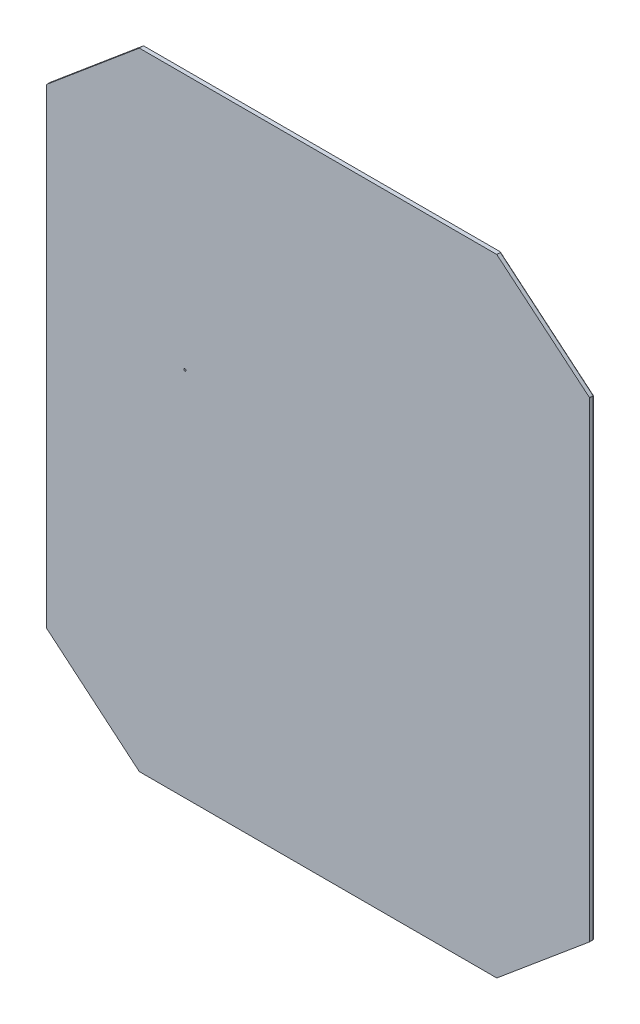
ISO-10303-21;
HEADER;
FILE_DESCRIPTION(('STEP AP214'),'2;1');
FILE_NAME('part.step','',(''),(''),'','','');
FILE_SCHEMA(('AUTOMOTIVE_DESIGN { 1 0 10303 214 1 1 1 1 }'));
ENDSEC;
DATA;
#1=APPLICATION_CONTEXT('core data for automotive mechanical design processes');
#2=APPLICATION_PROTOCOL_DEFINITION('international standard','automotive_design',2000,#1);
#3=PRODUCT_CONTEXT('',#1,'mechanical');
#4=PRODUCT('Part','Part','',(#3));
#5=PRODUCT_RELATED_PRODUCT_CATEGORY('part','',(#4));
#6=PRODUCT_DEFINITION_FORMATION('','',#4);
#7=PRODUCT_DEFINITION_CONTEXT('part definition',#1,'design');
#8=PRODUCT_DEFINITION('design','',#6,#7);
#9=PRODUCT_DEFINITION_SHAPE('','',#8);
#10=(LENGTH_UNIT() NAMED_UNIT(*) SI_UNIT(.MILLI.,.METRE.));
#11=(NAMED_UNIT(*) PLANE_ANGLE_UNIT() SI_UNIT($,.RADIAN.));
#12=(NAMED_UNIT(*) SI_UNIT($,.STERADIAN.) SOLID_ANGLE_UNIT());
#13=UNCERTAINTY_MEASURE_WITH_UNIT(LENGTH_MEASURE(1.E-05),#10,'distance_accuracy_value','');
#14=(GEOMETRIC_REPRESENTATION_CONTEXT(3) GLOBAL_UNCERTAINTY_ASSIGNED_CONTEXT((#13)) GLOBAL_UNIT_ASSIGNED_CONTEXT((#10,
#11,#12)) REPRESENTATION_CONTEXT('',''));
#15=CARTESIAN_POINT('',(0.,0.,0.));
#16=DIRECTION('',(0.,0.,1.));
#17=DIRECTION('',(1.,0.,0.));
#18=AXIS2_PLACEMENT_3D('',#15,#16,#17);
#19=CARTESIAN_POINT('',(-54.129658785069,2448.47514998125,2.));
#20=DIRECTION('',(0.,-1.,0.));
#21=DIRECTION('',(1.,0.,0.));
#22=AXIS2_PLACEMENT_3D('',#19,#20,#21);
#23=CYLINDRICAL_SURFACE('',#22,2.);
#24=DIRECTION('',(0.,-1.,0.));
#25=VECTOR('',#24,1.);
#26=CARTESIAN_POINT('',(-54.1296587850687,0.,0.));
#27=LINE('',#26,#25);
#28=CARTESIAN_POINT('',(-54.1296587850688,1069.56539523212,0.));
#29=VERTEX_POINT('',#28);
#30=CARTESIAN_POINT('',(-54.129658785069,2447.54258559121,0.));
#31=VERTEX_POINT('',#30);
#32=EDGE_CURVE('E237',#29,#31,#27,.F.);
#33=ORIENTED_EDGE('',*,*,#32,.F.);
#34=CARTESIAN_POINT('',(-54.1296587850688,1069.56539523212,2.));
#35=DIRECTION('',(0.,-1.,0.));
#36=DIRECTION('',(1.,0.,0.));
#37=AXIS2_PLACEMENT_3D('',#34,#35,#36);
#38=CIRCLE('',#37,2.);
#39=CARTESIAN_POINT('',(-56.1296587850688,1069.56539523212,2.));
#40=VERTEX_POINT('',#39);
#41=EDGE_CURVE('E253',#29,#40,#38,.F.);
#42=ORIENTED_EDGE('',*,*,#41,.T.);
#43=DIRECTION('',(0.,-1.,0.));
#44=VECTOR('',#43,1.);
#45=CARTESIAN_POINT('',(-56.129658785069,2448.47514998125,2.));
#46=LINE('',#45,#44);
#47=CARTESIAN_POINT('',(-56.129658785069,2447.54258559121,2.));
#48=VERTEX_POINT('',#47);
#49=EDGE_CURVE('E225',#48,#40,#46,.T.);
#50=ORIENTED_EDGE('',*,*,#49,.F.);
#51=CARTESIAN_POINT('',(-54.129658785069,2447.54258559121,2.));
#52=DIRECTION('',(0.,1.,0.));
#53=DIRECTION('',(0.,0.,1.));
#54=AXIS2_PLACEMENT_3D('',#51,#52,#53);
#55=CIRCLE('',#54,2.);
#56=EDGE_CURVE('E216',#31,#48,#55,.T.);
#57=ORIENTED_EDGE('',*,*,#56,.F.);
#58=EDGE_LOOP('',(#33,#42,#50,#57));
#59=FACE_BOUND('',#58,.T.);
#60=ADVANCED_FACE('F38',(#59),#23,.T.);
#61=CARTESIAN_POINT('',(1531.8095894244,1068.53127208685,2.));
#62=DIRECTION('',(0.,1.,0.));
#63=DIRECTION('',(0.,0.,1.));
#64=AXIS2_PLACEMENT_3D('',#61,#62,#63);
#65=CYLINDRICAL_SURFACE('',#64,2.);
#66=DIRECTION('',(0.,1.,0.));
#67=VECTOR('',#66,1.);
#68=CARTESIAN_POINT('',(1533.8095894244,1068.53127208685,2.));
#69=LINE('',#68,#67);
#70=CARTESIAN_POINT('',(1533.8095894244,1069.46560103322,2.));
#71=VERTEX_POINT('',#70);
#72=CARTESIAN_POINT('',(1533.8095894244,2447.61970402475,2.));
#73=VERTEX_POINT('',#72);
#74=EDGE_CURVE('E202',#71,#73,#69,.T.);
#75=ORIENTED_EDGE('',*,*,#74,.F.);
#76=CARTESIAN_POINT('',(1531.8095894244,1069.46560103322,2.));
#77=DIRECTION('',(0.,1.,0.));
#78=DIRECTION('',(0.,0.,1.));
#79=AXIS2_PLACEMENT_3D('',#76,#77,#78);
#80=CIRCLE('',#79,2.);
#81=CARTESIAN_POINT('',(1531.8095894244,1069.46560103322,0.));
#82=VERTEX_POINT('',#81);
#83=EDGE_CURVE('E62',#71,#82,#80,.T.);
#84=ORIENTED_EDGE('',*,*,#83,.T.);
#85=DIRECTION('',(0.,1.,0.));
#86=VECTOR('',#85,1.);
#87=CARTESIAN_POINT('',(1531.8095894244,0.,0.));
#88=LINE('',#87,#86);
#89=CARTESIAN_POINT('',(1531.8095894244,2447.61970402475,0.));
#90=VERTEX_POINT('',#89);
#91=EDGE_CURVE('E211',#90,#82,#88,.F.);
#92=ORIENTED_EDGE('',*,*,#91,.F.);
#93=CARTESIAN_POINT('',(1531.8095894244,2447.61970402475,2.));
#94=DIRECTION('',(0.,1.,2.22044604925031E-13));
#95=DIRECTION('',(0.,-2.22044604925031E-13,1.));
#96=AXIS2_PLACEMENT_3D('',#93,#94,#95);
#97=CIRCLE('',#96,2.);
#98=EDGE_CURVE('E165',#73,#90,#97,.T.);
#99=ORIENTED_EDGE('',*,*,#98,.F.);
#100=EDGE_LOOP('',(#75,#84,#92,#99));
#101=FACE_BOUND('',#100,.T.);
#102=ADVANCED_FACE('F370',(#101),#65,.T.);
#103=CARTESIAN_POINT('',(348.809589424397,1926.61056543439,11.9999999999964));
#104=DIRECTION('',(0.,0.,1.));
#105=DIRECTION('',(1.,0.,0.));
#106=AXIS2_PLACEMENT_3D('',#103,#104,#105);
#107=CYLINDRICAL_SURFACE('',#106,3.);
#108=CARTESIAN_POINT('',(348.809589424397,1926.61056543439,11.9749999999964));
#109=DIRECTION('',(0.,0.,1.));
#110=DIRECTION('',(1.,0.,0.));
#111=AXIS2_PLACEMENT_3D('',#108,#109,#110);
#112=CIRCLE('',#111,3.);
#113=CARTESIAN_POINT('',(351.809589424397,1926.61056543439,11.9749999999964));
#114=VERTEX_POINT('',#113);
#115=EDGE_CURVE('E437',#114,#114,#112,.T.);
#116=ORIENTED_EDGE('',*,*,#115,.T.);
#117=EDGE_LOOP('',(#116));
#118=FACE_BOUND('',#117,.T.);
#119=CARTESIAN_POINT('',(348.809589424397,1926.61056543439,0.));
#120=DIRECTION('',(0.,0.,1.));
#121=DIRECTION('',(1.,0.,0.));
#122=AXIS2_PLACEMENT_3D('',#119,#120,#121);
#123=CIRCLE('',#122,3.);
#124=CARTESIAN_POINT('',(351.809589424397,1926.61056543439,0.));
#125=VERTEX_POINT('',#124);
#126=EDGE_CURVE('E42',#125,#125,#123,.T.);
#127=ORIENTED_EDGE('',*,*,#126,.F.);
#128=EDGE_LOOP('',(#127));
#129=FACE_BOUND('',#128,.T.);
#130=ADVANCED_FACE('F353',(#118,#129),#107,.F.);
#131=CARTESIAN_POINT('',(-54.1296587850689,1069.56539523212,12.));
#132=DIRECTION('',(0.,0.,-1.));
#133=DIRECTION('',(-1.,0.,0.));
#134=AXIS2_PLACEMENT_3D('',#131,#132,#133);
#135=CYLINDRICAL_SURFACE('',#134,2.);
#136=CARTESIAN_POINT('',(-54.1296587850689,1069.56539523212,12.));
#137=DIRECTION('',(0.,0.,1.));
#138=DIRECTION('',(1.,0.,0.));
#139=AXIS2_PLACEMENT_3D('',#136,#137,#138);
#140=CIRCLE('',#139,2.);
#141=CARTESIAN_POINT('',(-56.1296587850688,1069.56539523212,12.));
#142=VERTEX_POINT('',#141);
#143=CARTESIAN_POINT('',(-55.4152980920153,1068.03336012403,12.));
#144=VERTEX_POINT('',#143);
#145=EDGE_CURVE('E251',#142,#144,#140,.T.);
#146=ORIENTED_EDGE('',*,*,#145,.F.);
#147=DIRECTION('',(0.,0.,-1.));
#148=VECTOR('',#147,1.);
#149=CARTESIAN_POINT('',(-56.1296587850688,1069.56539523212,12.));
#150=LINE('',#149,#148);
#151=EDGE_CURVE('E249',#40,#142,#150,.F.);
#152=ORIENTED_EDGE('',*,*,#151,.F.);
#153=CARTESIAN_POINT('',(-54.1296587850688,1069.56539523212,2.));
#154=DIRECTION('',(0.,0.,1.));
#155=DIRECTION('',(1.,0.,0.));
#156=AXIS2_PLACEMENT_3D('',#153,#154,#155);
#157=CIRCLE('',#156,2.);
#158=CARTESIAN_POINT('',(-55.4152980920152,1068.03336012403,2.));
#159=VERTEX_POINT('',#158);
#160=EDGE_CURVE('E260',#40,#159,#157,.T.);
#161=ORIENTED_EDGE('',*,*,#160,.T.);
#162=DIRECTION('',(0.,0.,-1.));
#163=VECTOR('',#162,1.);
#164=CARTESIAN_POINT('',(-55.4152980920153,1068.03336012403,12.));
#165=LINE('',#164,#163);
#166=EDGE_CURVE('E246',#144,#159,#165,.T.);
#167=ORIENTED_EDGE('',*,*,#166,.F.);
#168=EDGE_LOOP('',(#146,#152,#161,#167));
#169=FACE_BOUND('',#168,.T.);
#170=ADVANCED_FACE('F313',(#169),#135,.T.);
#171=CARTESIAN_POINT('',(-56.129658785069,2448.47514998125,12.));
#172=DIRECTION('',(1.,0.,0.));
#173=DIRECTION('',(0.,1.,0.));
#174=AXIS2_PLACEMENT_3D('',#171,#172,#173);
#175=PLANE('',#174);
#176=ORIENTED_EDGE('',*,*,#49,.T.);
#177=ORIENTED_EDGE('',*,*,#151,.T.);
#178=DIRECTION('',(0.,-1.,0.));
#179=VECTOR('',#178,1.);
#180=CARTESIAN_POINT('',(-56.129658785069,2448.47514998125,12.));
#181=LINE('',#180,#179);
#182=CARTESIAN_POINT('',(-56.129658785069,2447.54258559121,12.));
#183=VERTEX_POINT('',#182);
#184=EDGE_CURVE('E183',#183,#142,#181,.T.);
#185=ORIENTED_EDGE('',*,*,#184,.F.);
#186=DIRECTION('',(0.,0.,-1.));
#187=VECTOR('',#186,1.);
#188=CARTESIAN_POINT('',(-56.129658785069,2447.54258559121,12.));
#189=LINE('',#188,#187);
#190=EDGE_CURVE('E228',#183,#48,#189,.T.);
#191=ORIENTED_EDGE('',*,*,#190,.T.);
#192=EDGE_LOOP('',(#176,#177,#185,#191));
#193=FACE_BOUND('',#192,.T.);
#194=ADVANCED_FACE('F345',(#193),#175,.F.);
#195=CARTESIAN_POINT('',(1533.8095894244,1068.53127208685,12.));
#196=DIRECTION('',(-1.,0.,0.));
#197=DIRECTION('',(0.,0.,1.));
#198=AXIS2_PLACEMENT_3D('',#195,#196,#197);
#199=PLANE('',#198);
#200=DIRECTION('',(0.,1.,0.));
#201=VECTOR('',#200,1.);
#202=CARTESIAN_POINT('',(1533.8095894244,1068.53127208685,12.));
#203=LINE('',#202,#201);
#204=CARTESIAN_POINT('',(1533.8095894244,1069.46560103322,12.));
#205=VERTEX_POINT('',#204);
#206=CARTESIAN_POINT('',(1533.8095894244,2447.61970402475,12.));
#207=VERTEX_POINT('',#206);
#208=EDGE_CURVE('E174',#205,#207,#203,.T.);
#209=ORIENTED_EDGE('',*,*,#208,.F.);
#210=DIRECTION('',(0.,0.,-1.));
#211=VECTOR('',#210,1.);
#212=CARTESIAN_POINT('',(1533.8095894244,1069.46560103322,12.));
#213=LINE('',#212,#211);
#214=EDGE_CURVE('E259',#205,#71,#213,.T.);
#215=ORIENTED_EDGE('',*,*,#214,.T.);
#216=ORIENTED_EDGE('',*,*,#74,.T.);
#217=DIRECTION('',(0.,0.,-1.));
#218=VECTOR('',#217,1.);
#219=CARTESIAN_POINT('',(1533.8095894244,2447.61970402475,12.));
#220=LINE('',#219,#218);
#221=EDGE_CURVE('E204',#73,#207,#220,.F.);
#222=ORIENTED_EDGE('',*,*,#221,.T.);
#223=EDGE_LOOP('',(#209,#215,#216,#222));
#224=FACE_BOUND('',#223,.T.);
#225=ADVANCED_FACE('F286',(#224),#199,.F.);
#226=CARTESIAN_POINT('',(1531.8095894244,1069.46560103322,12.));
#227=DIRECTION('',(0.,0.,-1.));
#228=DIRECTION('',(-1.,0.,0.));
#229=AXIS2_PLACEMENT_3D('',#226,#227,#228);
#230=CYLINDRICAL_SURFACE('',#229,2.);
#231=CARTESIAN_POINT('',(1531.8095894244,1069.46560103322,12.));
#232=DIRECTION('',(0.,0.,1.));
#233=DIRECTION('',(1.,0.,0.));
#234=AXIS2_PLACEMENT_3D('',#231,#232,#233);
#235=CIRCLE('',#234,2.);
#236=CARTESIAN_POINT('',(1533.09300756478,1067.93170472743,12.));
#237=VERTEX_POINT('',#236);
#238=EDGE_CURVE('E270',#237,#205,#235,.T.);
#239=ORIENTED_EDGE('',*,*,#238,.F.);
#240=DIRECTION('',(0.,0.,-1.));
#241=VECTOR('',#240,1.);
#242=CARTESIAN_POINT('',(1533.09300756478,1067.93170472743,12.));
#243=LINE('',#242,#241);
#244=CARTESIAN_POINT('',(1533.09300756478,1067.93170472743,2.));
#245=VERTEX_POINT('',#244);
#246=EDGE_CURVE('E171',#245,#237,#243,.F.);
#247=ORIENTED_EDGE('',*,*,#246,.F.);
#248=CARTESIAN_POINT('',(1531.8095894244,1069.46560103322,2.));
#249=DIRECTION('',(0.,0.,1.));
#250=DIRECTION('',(1.,0.,0.));
#251=AXIS2_PLACEMENT_3D('',#248,#249,#250);
#252=CIRCLE('',#251,2.);
#253=EDGE_CURVE('E274',#245,#71,#252,.T.);
#254=ORIENTED_EDGE('',*,*,#253,.T.);
#255=ORIENTED_EDGE('',*,*,#214,.F.);
#256=EDGE_LOOP('',(#239,#247,#254,#255));
#257=FACE_BOUND('',#256,.T.);
#258=ADVANCED_FACE('F282',(#257),#230,.T.);
#259=CARTESIAN_POINT('',(348.809589424397,1926.61056543439,11.9999999999964));
#260=DIRECTION('',(0.,0.,1.));
#261=DIRECTION('',(1.,0.,0.));
#262=AXIS2_PLACEMENT_3D('',#259,#260,#261);
#263=CONICAL_SURFACE('',#262,3.025,0.785398163397344);
#264=ORIENTED_EDGE('',*,*,#115,.F.);
#265=EDGE_LOOP('',(#264));
#266=FACE_BOUND('',#265,.T.);
#267=CARTESIAN_POINT('',(348.809589424397,1926.61056543439,11.9999999999964));
#268=DIRECTION('',(0.,0.,1.));
#269=DIRECTION('',(1.,0.,0.));
#270=AXIS2_PLACEMENT_3D('',#267,#268,#269);
#271=CIRCLE('',#270,3.025);
#272=CARTESIAN_POINT('',(351.834589424397,1926.61056543439,11.9999999999964));
#273=VERTEX_POINT('',#272);
#274=EDGE_CURVE('E436',#273,#273,#271,.T.);
#275=ORIENTED_EDGE('',*,*,#274,.T.);
#276=EDGE_LOOP('',(#275));
#277=FACE_BOUND('',#276,.T.);
#278=ADVANCED_FACE('F386',(#266,#277),#263,.F.);
#279=CARTESIAN_POINT('',(-54.129658785069,2447.54258559121,12.));
#280=DIRECTION('',(0.,0.,-1.));
#281=DIRECTION('',(-1.,0.,0.));
#282=AXIS2_PLACEMENT_3D('',#279,#280,#281);
#283=CYLINDRICAL_SURFACE('',#282,2.);
#284=CARTESIAN_POINT('',(-54.129658785069,2447.54258559121,12.));
#285=DIRECTION('',(0.,0.,1.));
#286=DIRECTION('',(1.,0.,0.));
#287=AXIS2_PLACEMENT_3D('',#284,#285,#286);
#288=CIRCLE('',#287,2.);
#289=CARTESIAN_POINT('',(-55.4152980920152,2449.0746206993,12.));
#290=VERTEX_POINT('',#289);
#291=EDGE_CURVE('E233',#290,#183,#288,.T.);
#292=ORIENTED_EDGE('',*,*,#291,.F.);
#293=DIRECTION('',(0.,0.,-1.));
#294=VECTOR('',#293,1.);
#295=CARTESIAN_POINT('',(-55.4152980920153,2449.0746206993,12.));
#296=LINE('',#295,#294);
#297=CARTESIAN_POINT('',(-55.4152980920154,2449.0746206993,2.));
#298=VERTEX_POINT('',#297);
#299=EDGE_CURVE('E231',#298,#290,#296,.F.);
#300=ORIENTED_EDGE('',*,*,#299,.F.);
#301=CARTESIAN_POINT('',(-54.1296587850689,2447.54258559121,2.));
#302=DIRECTION('',(0.,0.,1.));
#303=DIRECTION('',(1.,0.,0.));
#304=AXIS2_PLACEMENT_3D('',#301,#302,#303);
#305=CIRCLE('',#304,2.);
#306=EDGE_CURVE('E240',#298,#48,#305,.T.);
#307=ORIENTED_EDGE('',*,*,#306,.T.);
#308=ORIENTED_EDGE('',*,*,#190,.F.);
#309=EDGE_LOOP('',(#292,#300,#307,#308));
#310=FACE_BOUND('',#309,.T.);
#311=ADVANCED_FACE('F344',(#310),#283,.T.);
#312=CARTESIAN_POINT('',(1531.8095894244,2447.61970402475,12.));
#313=DIRECTION('',(0.,0.,-1.));
#314=DIRECTION('',(-1.,0.,0.));
#315=AXIS2_PLACEMENT_3D('',#312,#313,#314);
#316=CYLINDRICAL_SURFACE('',#315,2.);
#317=CARTESIAN_POINT('',(1531.8095894244,2447.61970402475,12.));
#318=DIRECTION('',(0.,0.,1.));
#319=DIRECTION('',(1.,0.,0.));
#320=AXIS2_PLACEMENT_3D('',#317,#318,#319);
#321=CIRCLE('',#320,2.);
#322=CARTESIAN_POINT('',(1533.09306115109,2449.15355549304,12.));
#323=VERTEX_POINT('',#322);
#324=EDGE_CURVE('E207',#207,#323,#321,.T.);
#325=ORIENTED_EDGE('',*,*,#324,.F.);
#326=ORIENTED_EDGE('',*,*,#221,.F.);
#327=CARTESIAN_POINT('',(1531.8095894244,2447.61970402475,2.));
#328=DIRECTION('',(0.,0.,1.));
#329=DIRECTION('',(1.,0.,0.));
#330=AXIS2_PLACEMENT_3D('',#327,#328,#329);
#331=CIRCLE('',#330,2.);
#332=CARTESIAN_POINT('',(1533.09306115109,2449.15355549304,2.));
#333=VERTEX_POINT('',#332);
#334=EDGE_CURVE('E214',#73,#333,#331,.T.);
#335=ORIENTED_EDGE('',*,*,#334,.T.);
#336=DIRECTION('',(0.,0.,-1.));
#337=VECTOR('',#336,1.);
#338=CARTESIAN_POINT('',(1533.09306115109,2449.15355549304,12.));
#339=LINE('',#338,#337);
#340=EDGE_CURVE('E199',#323,#333,#339,.T.);
#341=ORIENTED_EDGE('',*,*,#340,.F.);
#342=EDGE_LOOP('',(#325,#326,#335,#341));
#343=FACE_BOUND('',#342,.T.);
#344=ADVANCED_FACE('F400',(#343),#316,.T.);
#345=CARTESIAN_POINT('',(0.,0.,12.));
#346=DIRECTION('',(0.,0.,1.));
#347=DIRECTION('',(1.,0.,0.));
#348=AXIS2_PLACEMENT_3D('',#345,#346,#347);
#349=PLANE('',#348);
#350=ORIENTED_EDGE('',*,*,#274,.F.);
#351=EDGE_LOOP('',(#350));
#352=FACE_BOUND('',#351,.T.);
#353=DIRECTION('',(0.766948152896775,0.641709070193203,0.));
#354=VECTOR('',#353,1.);
#355=CARTESIAN_POINT('',(1151.3095894244,748.491751264202,12.));
#356=LINE('',#355,#354);
#357=CARTESIAN_POINT('',(1261.9367281695,841.053990411817,12.));
#358=VERTEX_POINT('',#357);
#359=EDGE_CURVE('E168',#358,#237,#356,.T.);
#360=ORIENTED_EDGE('',*,*,#359,.T.);
#361=ORIENTED_EDGE('',*,*,#238,.T.);
#362=ORIENTED_EDGE('',*,*,#208,.T.);
#363=ORIENTED_EDGE('',*,*,#324,.T.);
#364=DIRECTION('',(-0.766925734145325,0.641735863346949,0.));
#365=VECTOR('',#364,1.);
#366=CARTESIAN_POINT('',(1151.3095894244,2768.61622955908,12.));
#367=LINE('',#366,#365);
#368=CARTESIAN_POINT('',(1261.92887574869,2676.05399041182,12.));
#369=VERTEX_POINT('',#368);
#370=EDGE_CURVE('E289',#323,#369,#367,.T.);
#371=ORIENTED_EDGE('',*,*,#370,.T.);
#372=DIRECTION('',(-1.,0.,0.));
#373=VECTOR('',#372,1.);
#374=CARTESIAN_POINT('',(1.93696365804209E-12,2676.05399041182,12.));
#375=LINE('',#374,#373);
#376=CARTESIAN_POINT('',(215.065202413765,2676.05399041182,12.));
#377=VERTEX_POINT('',#376);
#378=EDGE_CURVE('E290',#369,#377,#375,.T.);
#379=ORIENTED_EDGE('',*,*,#378,.T.);
#380=DIRECTION('',(-0.766017554047301,-0.642819653473188,0.));
#381=VECTOR('',#380,1.);
#382=CARTESIAN_POINT('',(-56.129658785069,2448.47514998125,12.));
#383=LINE('',#382,#381);
#384=EDGE_CURVE('E179',#377,#290,#383,.T.);
#385=ORIENTED_EDGE('',*,*,#384,.T.);
#386=ORIENTED_EDGE('',*,*,#291,.T.);
#387=ORIENTED_EDGE('',*,*,#184,.T.);
#388=ORIENTED_EDGE('',*,*,#145,.T.);
#389=DIRECTION('',(0.766017554047301,-0.642819653473189,0.));
#390=VECTOR('',#389,1.);
#391=CARTESIAN_POINT('',(326.309589424397,747.700936122895,12.));
#392=LINE('',#391,#390);
#393=CARTESIAN_POINT('',(215.065202413403,841.053990411817,12.));
#394=VERTEX_POINT('',#393);
#395=EDGE_CURVE('E175',#144,#394,#392,.T.);
#396=ORIENTED_EDGE('',*,*,#395,.T.);
#397=DIRECTION('',(1.,0.,0.));
#398=VECTOR('',#397,1.);
#399=CARTESIAN_POINT('',(-6.11684115650869E-13,841.053990411816,12.));
#400=LINE('',#399,#398);
#401=EDGE_CURVE('E159',#394,#358,#400,.T.);
#402=ORIENTED_EDGE('',*,*,#401,.T.);
#403=EDGE_LOOP('',(#360,#361,#362,#363,#371,#379,#385,#386,#387,#388,#396,#402));
#404=FACE_BOUND('',#403,.T.);
#405=ADVANCED_FACE('F177',(#352,#404),#349,.T.);
#406=CARTESIAN_POINT('',(-56.129658785069,2448.47514998125,12.));
#407=DIRECTION('',(0.642819653473189,-0.766017554047301,0.));
#408=DIRECTION('',(0.766017554047301,0.642819653473189,0.));
#409=AXIS2_PLACEMENT_3D('',#406,#407,#408);
#410=PLANE('',#409);
#411=DIRECTION('',(-0.766017554047301,-0.642819653473189,0.));
#412=VECTOR('',#411,1.);
#413=CARTESIAN_POINT('',(-56.129658785069,2448.47514998125,2.));
#414=LINE('',#413,#412);
#415=CARTESIAN_POINT('',(215.065202413765,2676.05399041182,2.));
#416=VERTEX_POINT('',#415);
#417=EDGE_CURVE('E213',#416,#298,#414,.T.);
#418=ORIENTED_EDGE('',*,*,#417,.T.);
#419=ORIENTED_EDGE('',*,*,#299,.T.);
#420=ORIENTED_EDGE('',*,*,#384,.F.);
#421=DIRECTION('',(0.,0.,1.));
#422=VECTOR('',#421,1.);
#423=CARTESIAN_POINT('',(215.065202413765,2676.05399041182,11.9999999999981));
#424=LINE('',#423,#422);
#425=EDGE_CURVE('E295',#416,#377,#424,.T.);
#426=ORIENTED_EDGE('',*,*,#425,.F.);
#427=EDGE_LOOP('',(#418,#419,#420,#426));
#428=FACE_BOUND('',#427,.T.);
#429=ADVANCED_FACE('F341',(#428),#410,.F.);
#430=CARTESIAN_POINT('',(-54.129658785069,2447.54258559121,2.));
#431=DIRECTION('',(1.,0.,0.));
#432=DIRECTION('',(0.,1.,0.));
#433=AXIS2_PLACEMENT_3D('',#430,#431,#432);
#434=SPHERICAL_SURFACE('',#433,2.);
#435=CARTESIAN_POINT('',(-54.1296587850689,2447.54258559121,2.));
#436=DIRECTION('',(-0.766017554047301,-0.642819653473189,0.));
#437=DIRECTION('',(0.642819653473189,-0.766017554047301,0.));
#438=AXIS2_PLACEMENT_3D('',#435,#436,#437);
#439=CIRCLE('',#438,2.);
#440=EDGE_CURVE('E235',#31,#298,#439,.F.);
#441=ORIENTED_EDGE('',*,*,#440,.F.);
#442=ORIENTED_EDGE('',*,*,#56,.T.);
#443=ORIENTED_EDGE('',*,*,#306,.F.);
#444=EDGE_LOOP('',(#441,#442,#443));
#445=FACE_BOUND('',#444,.T.);
#446=ADVANCED_FACE('F333',(#445),#434,.T.);
#447=CARTESIAN_POINT('',(326.309589424397,747.700936122895,12.));
#448=DIRECTION('',(0.642819653473188,0.766017554047301,0.));
#449=DIRECTION('',(-0.766017554047301,0.642819653473189,0.));
#450=AXIS2_PLACEMENT_3D('',#447,#448,#449);
#451=PLANE('',#450);
#452=ORIENTED_EDGE('',*,*,#395,.F.);
#453=ORIENTED_EDGE('',*,*,#166,.T.);
#454=DIRECTION('',(0.766017554047301,-0.642819653473189,0.));
#455=VECTOR('',#454,1.);
#456=CARTESIAN_POINT('',(326.309589424397,747.700936122895,2.));
#457=LINE('',#456,#455);
#458=CARTESIAN_POINT('',(215.065202413404,841.053990411817,2.));
#459=VERTEX_POINT('',#458);
#460=EDGE_CURVE('E239',#159,#459,#457,.T.);
#461=ORIENTED_EDGE('',*,*,#460,.T.);
#462=DIRECTION('',(0.,0.,-1.));
#463=VECTOR('',#462,1.);
#464=CARTESIAN_POINT('',(215.065202413403,841.053990411817,11.9999999999993));
#465=LINE('',#464,#463);
#466=EDGE_CURVE('E164',#394,#459,#465,.T.);
#467=ORIENTED_EDGE('',*,*,#466,.F.);
#468=EDGE_LOOP('',(#452,#453,#461,#467));
#469=FACE_BOUND('',#468,.T.);
#470=ADVANCED_FACE('F316',(#469),#451,.F.);
#471=CARTESIAN_POINT('',(1151.3095894244,748.491751264202,12.));
#472=DIRECTION('',(-0.641709070193203,0.766948152896774,0.));
#473=DIRECTION('',(-0.766948152896775,-0.641709070193203,0.));
#474=AXIS2_PLACEMENT_3D('',#471,#472,#473);
#475=PLANE('',#474);
#476=DIRECTION('',(0.766948152896775,0.641709070193203,0.));
#477=VECTOR('',#476,1.);
#478=CARTESIAN_POINT('',(1151.3095894244,748.491751264202,2.));
#479=LINE('',#478,#477);
#480=CARTESIAN_POINT('',(1261.9367281695,841.053990411817,2.));
#481=VERTEX_POINT('',#480);
#482=EDGE_CURVE('E267',#481,#245,#479,.T.);
#483=ORIENTED_EDGE('',*,*,#482,.T.);
#484=ORIENTED_EDGE('',*,*,#246,.T.);
#485=ORIENTED_EDGE('',*,*,#359,.F.);
#486=DIRECTION('',(0.,0.,1.));
#487=VECTOR('',#486,1.);
#488=CARTESIAN_POINT('',(1261.9367281695,841.053990411817,11.9999999999993));
#489=LINE('',#488,#487);
#490=EDGE_CURVE('E154',#481,#358,#489,.T.);
#491=ORIENTED_EDGE('',*,*,#490,.F.);
#492=EDGE_LOOP('',(#483,#484,#485,#491));
#493=FACE_BOUND('',#492,.T.);
#494=ADVANCED_FACE('F169',(#493),#475,.F.);
#495=CARTESIAN_POINT('',(1531.8095894244,1069.46560103322,2.));
#496=DIRECTION('',(-0.641709070193203,0.766948152896774,0.));
#497=DIRECTION('',(-0.766948152896775,-0.641709070193203,0.));
#498=AXIS2_PLACEMENT_3D('',#495,#496,#497);
#499=SPHERICAL_SURFACE('',#498,2.);
#500=CARTESIAN_POINT('',(1531.8095894244,1069.46560103322,2.));
#501=DIRECTION('',(0.76694815289677,0.641709070193209,0.));
#502=DIRECTION('',(-0.641709070193209,0.76694815289677,0.));
#503=AXIS2_PLACEMENT_3D('',#500,#501,#502);
#504=CIRCLE('',#503,2.);
#505=EDGE_CURVE('E262',#245,#82,#504,.T.);
#506=ORIENTED_EDGE('',*,*,#505,.T.);
#507=ORIENTED_EDGE('',*,*,#83,.F.);
#508=ORIENTED_EDGE('',*,*,#253,.F.);
#509=EDGE_LOOP('',(#506,#507,#508));
#510=FACE_BOUND('',#509,.T.);
#511=ADVANCED_FACE('F279',(#510),#499,.T.);
#512=CARTESIAN_POINT('',(0.,0.,0.));
#513=DIRECTION('',(0.,0.,1.));
#514=DIRECTION('',(1.,0.,0.));
#515=AXIS2_PLACEMENT_3D('',#512,#513,#514);
#516=PLANE('',#515);
#517=ORIENTED_EDGE('',*,*,#126,.T.);
#518=EDGE_LOOP('',(#517));
#519=FACE_BOUND('',#518,.T.);
#520=ORIENTED_EDGE('',*,*,#91,.T.);
#521=DIRECTION('',(0.766948152896775,0.641709070193203,0.));
#522=VECTOR('',#521,1.);
#523=CARTESIAN_POINT('',(104.439075262917,-124.82191632265,0.));
#524=LINE('',#523,#522);
#525=CARTESIAN_POINT('',(1258.82005101329,841.053990411817,0.));
#526=VERTEX_POINT('',#525);
#527=EDGE_CURVE('E47',#82,#526,#524,.F.);
#528=ORIENTED_EDGE('',*,*,#527,.T.);
#529=DIRECTION('',(1.,0.,0.));
#530=VECTOR('',#529,1.);
#531=CARTESIAN_POINT('',(-6.11684115650869E-13,841.053990411816,0.));
#532=LINE('',#531,#530);
#533=CARTESIAN_POINT('',(218.176494965201,841.053990411816,0.));
#534=VERTEX_POINT('',#533);
#535=EDGE_CURVE('E180',#534,#526,#532,.T.);
#536=ORIENTED_EDGE('',*,*,#535,.F.);
#537=DIRECTION('',(0.766017554047301,-0.642819653473189,0.));
#538=VECTOR('',#537,1.);
#539=CARTESIAN_POINT('',(504.298613123565,600.948630066227,0.));
#540=LINE('',#539,#538);
#541=EDGE_CURVE('E257',#534,#29,#540,.F.);
#542=ORIENTED_EDGE('',*,*,#541,.T.);
#543=ORIENTED_EDGE('',*,*,#32,.T.);
#544=DIRECTION('',(-0.766017554047301,-0.642819653473189,0.));
#545=VECTOR('',#544,1.);
#546=CARTESIAN_POINT('',(-1227.56453245833,1462.83016629667,0.));
#547=LINE('',#546,#545);
#548=CARTESIAN_POINT('',(218.176494965563,2676.05399041182,0.));
#549=VERTEX_POINT('',#548);
#550=EDGE_CURVE('E221',#31,#549,#547,.F.);
#551=ORIENTED_EDGE('',*,*,#550,.T.);
#552=DIRECTION('',(-1.,0.,0.));
#553=VECTOR('',#552,1.);
#554=CARTESIAN_POINT('',(1.93696365804209E-12,2676.05399041182,0.));
#555=LINE('',#554,#553);
#556=CARTESIAN_POINT('',(1258.81232871707,2676.05399041182,0.));
#557=VERTEX_POINT('',#556);
#558=EDGE_CURVE('E194',#557,#549,#555,.T.);
#559=ORIENTED_EDGE('',*,*,#558,.F.);
#560=DIRECTION('',(-0.766925734145325,0.641735863346949,0.));
#561=VECTOR('',#560,1.);
#562=CARTESIAN_POINT('',(1835.46704654131,2193.53006831598,0.));
#563=LINE('',#562,#561);
#564=EDGE_CURVE('E196',#557,#90,#563,.F.);
#565=ORIENTED_EDGE('',*,*,#564,.T.);
#566=EDGE_LOOP('',(#520,#528,#536,#542,#543,#551,#559,#565));
#567=FACE_BOUND('',#566,.T.);
#568=ADVANCED_FACE('F325',(#519,#567),#516,.F.);
#569=CARTESIAN_POINT('',(1150.02617128401,750.025647569995,2.));
#570=DIRECTION('',(0.766948152896775,0.641709070193203,0.));
#571=DIRECTION('',(-0.641709070193203,0.766948152896775,0.));
#572=AXIS2_PLACEMENT_3D('',#569,#570,#571);
#573=CYLINDRICAL_SURFACE('',#572,2.);
#574=CARTESIAN_POINT('',(1258.82005101329,841.053990411817,2.));
#575=DIRECTION('',(0.,-1.,0.));
#576=DIRECTION('',(1.,0.,0.));
#577=AXIS2_PLACEMENT_3D('',#574,#575,#576);
#578=ELLIPSE('',#577,3.1166771562039,2.);
#579=EDGE_CURVE('E11',#526,#481,#578,.T.);
#580=ORIENTED_EDGE('',*,*,#579,.F.);
#581=ORIENTED_EDGE('',*,*,#527,.F.);
#582=ORIENTED_EDGE('',*,*,#505,.F.);
#583=ORIENTED_EDGE('',*,*,#482,.F.);
#584=EDGE_LOOP('',(#580,#581,#582,#583));
#585=FACE_BOUND('',#584,.T.);
#586=ADVANCED_FACE('F40',(#585),#573,.T.);
#587=CARTESIAN_POINT('',(-54.1296587850688,1069.56539523212,2.));
#588=DIRECTION('',(0.642819653473188,0.766017554047301,0.));
#589=DIRECTION('',(-0.766017554047301,0.642819653473189,0.));
#590=AXIS2_PLACEMENT_3D('',#587,#588,#589);
#591=SPHERICAL_SURFACE('',#590,2.);
#592=ORIENTED_EDGE('',*,*,#41,.F.);
#593=CARTESIAN_POINT('',(-54.1296587850688,1069.56539523212,2.));
#594=DIRECTION('',(-0.766017554047288,0.642819653473204,0.));
#595=DIRECTION('',(-0.642819653473204,-0.766017554047288,0.));
#596=AXIS2_PLACEMENT_3D('',#593,#594,#595);
#597=CIRCLE('',#596,2.);
#598=EDGE_CURVE('E242',#29,#159,#597,.T.);
#599=ORIENTED_EDGE('',*,*,#598,.T.);
#600=ORIENTED_EDGE('',*,*,#160,.F.);
#601=EDGE_LOOP('',(#592,#599,#600));
#602=FACE_BOUND('',#601,.T.);
#603=ADVANCED_FACE('F379',(#602),#591,.T.);
#604=CARTESIAN_POINT('',(327.595228731344,749.23297123099,2.));
#605=DIRECTION('',(0.766017554047301,-0.642819653473189,0.));
#606=DIRECTION('',(0.642819653473189,0.766017554047301,0.));
#607=AXIS2_PLACEMENT_3D('',#604,#605,#606);
#608=CYLINDRICAL_SURFACE('',#607,2.);
#609=ORIENTED_EDGE('',*,*,#598,.F.);
#610=ORIENTED_EDGE('',*,*,#541,.F.);
#611=CARTESIAN_POINT('',(218.176494965201,841.053990411816,2.));
#612=DIRECTION('',(0.,-1.,0.));
#613=DIRECTION('',(1.,0.,0.));
#614=AXIS2_PLACEMENT_3D('',#611,#612,#613);
#615=ELLIPSE('',#614,3.11129255179722,2.);
#616=EDGE_CURVE('E255',#459,#534,#615,.T.);
#617=ORIENTED_EDGE('',*,*,#616,.F.);
#618=ORIENTED_EDGE('',*,*,#460,.F.);
#619=EDGE_LOOP('',(#609,#610,#617,#618));
#620=FACE_BOUND('',#619,.T.);
#621=ADVANCED_FACE('F322',(#620),#608,.T.);
#622=CARTESIAN_POINT('',(-54.8440194781226,2446.94311487316,2.));
#623=DIRECTION('',(-0.766017554047301,-0.642819653473189,0.));
#624=DIRECTION('',(0.642819653473189,-0.766017554047301,0.));
#625=AXIS2_PLACEMENT_3D('',#622,#623,#624);
#626=CYLINDRICAL_SURFACE('',#625,2.);
#627=ORIENTED_EDGE('',*,*,#550,.F.);
#628=ORIENTED_EDGE('',*,*,#440,.T.);
#629=ORIENTED_EDGE('',*,*,#417,.F.);
#630=CARTESIAN_POINT('',(218.176494965562,2676.05399041182,2.));
#631=DIRECTION('',(0.,1.,0.));
#632=DIRECTION('',(-1.,0.,0.));
#633=AXIS2_PLACEMENT_3D('',#630,#631,#632);
#634=ELLIPSE('',#633,3.11129255179722,2.);
#635=EDGE_CURVE('E223',#549,#416,#634,.T.);
#636=ORIENTED_EDGE('',*,*,#635,.F.);
#637=EDGE_LOOP('',(#627,#628,#629,#636));
#638=FACE_BOUND('',#637,.T.);
#639=ADVANCED_FACE('F336',(#638),#626,.T.);
#640=CARTESIAN_POINT('',(1531.8095894244,2447.61970402475,2.));
#641=DIRECTION('',(-1.,0.,0.));
#642=DIRECTION('',(0.,0.,1.));
#643=AXIS2_PLACEMENT_3D('',#640,#641,#642);
#644=SPHERICAL_SURFACE('',#643,2.);
#645=ORIENTED_EDGE('',*,*,#98,.T.);
#646=CARTESIAN_POINT('',(1531.8095894244,2447.61970402475,2.));
#647=DIRECTION('',(-0.766925734145325,0.641735863346949,0.));
#648=DIRECTION('',(-0.641735863346949,-0.766925734145325,0.));
#649=AXIS2_PLACEMENT_3D('',#646,#647,#648);
#650=CIRCLE('',#649,2.);
#651=EDGE_CURVE('E209',#333,#90,#650,.T.);
#652=ORIENTED_EDGE('',*,*,#651,.F.);
#653=ORIENTED_EDGE('',*,*,#334,.F.);
#654=EDGE_LOOP('',(#645,#652,#653));
#655=FACE_BOUND('',#654,.T.);
#656=ADVANCED_FACE('F404',(#655),#644,.T.);
#657=CARTESIAN_POINT('',(1151.3095894244,2768.61622955908,12.));
#658=DIRECTION('',(-0.641735863346949,-0.766925734145325,0.));
#659=DIRECTION('',(0.766925734145325,-0.641735863346949,0.));
#660=AXIS2_PLACEMENT_3D('',#657,#658,#659);
#661=PLANE('',#660);
#662=ORIENTED_EDGE('',*,*,#370,.F.);
#663=ORIENTED_EDGE('',*,*,#340,.T.);
#664=DIRECTION('',(-0.766925734145325,0.641735863346949,0.));
#665=VECTOR('',#664,1.);
#666=CARTESIAN_POINT('',(1151.3095894244,2768.61622955908,2.));
#667=LINE('',#666,#665);
#668=CARTESIAN_POINT('',(1261.92887574869,2676.05399041182,2.));
#669=VERTEX_POINT('',#668);
#670=EDGE_CURVE('E191',#333,#669,#667,.T.);
#671=ORIENTED_EDGE('',*,*,#670,.T.);
#672=DIRECTION('',(0.,0.,-1.));
#673=VECTOR('',#672,1.);
#674=CARTESIAN_POINT('',(1261.92887574869,2676.05399041182,12.0000000000008));
#675=LINE('',#674,#673);
#676=EDGE_CURVE('E301',#369,#669,#675,.T.);
#677=ORIENTED_EDGE('',*,*,#676,.F.);
#678=EDGE_LOOP('',(#662,#663,#671,#677));
#679=FACE_BOUND('',#678,.T.);
#680=ADVANCED_FACE('F365',(#679),#661,.F.);
#681=CARTESIAN_POINT('',(1150.0261176977,2767.08237809079,2.));
#682=DIRECTION('',(-0.766925734145325,0.641735863346949,0.));
#683=DIRECTION('',(-0.641735863346949,-0.766925734145325,0.));
#684=AXIS2_PLACEMENT_3D('',#681,#682,#683);
#685=CYLINDRICAL_SURFACE('',#684,2.);
#686=ORIENTED_EDGE('',*,*,#670,.F.);
#687=ORIENTED_EDGE('',*,*,#651,.T.);
#688=ORIENTED_EDGE('',*,*,#564,.F.);
#689=CARTESIAN_POINT('',(1258.81232871707,2676.05399041182,2.));
#690=DIRECTION('',(0.,1.,0.));
#691=DIRECTION('',(-1.,0.,0.));
#692=AXIS2_PLACEMENT_3D('',#689,#690,#691);
#693=ELLIPSE('',#692,3.11654703162307,2.);
#694=EDGE_CURVE('E193',#669,#557,#693,.T.);
#695=ORIENTED_EDGE('',*,*,#694,.F.);
#696=EDGE_LOOP('',(#686,#687,#688,#695));
#697=FACE_BOUND('',#696,.T.);
#698=ADVANCED_FACE('F358',(#697),#685,.T.);
#699=CARTESIAN_POINT('',(-6.11684115650869E-13,841.053990411816,-2.78608469145249E-12));
#700=DIRECTION('',(0.,-1.,0.));
#701=DIRECTION('',(0.,0.,-1.));
#702=AXIS2_PLACEMENT_3D('',#699,#700,#701);
#703=PLANE('',#702);
#704=ORIENTED_EDGE('',*,*,#535,.T.);
#705=ORIENTED_EDGE('',*,*,#579,.T.);
#706=ORIENTED_EDGE('',*,*,#490,.T.);
#707=ORIENTED_EDGE('',*,*,#401,.F.);
#708=ORIENTED_EDGE('',*,*,#466,.T.);
#709=ORIENTED_EDGE('',*,*,#616,.T.);
#710=EDGE_LOOP('',(#704,#705,#706,#707,#708,#709));
#711=FACE_BOUND('',#710,.T.);
#712=ADVANCED_FACE('F156',(#711),#703,.T.);
#713=CARTESIAN_POINT('',(1.93696365804209E-12,2676.05399041182,-9.26447493669704E-12));
#714=DIRECTION('',(0.,1.,0.));
#715=DIRECTION('',(0.,0.,1.));
#716=AXIS2_PLACEMENT_3D('',#713,#714,#715);
#717=PLANE('',#716);
#718=ORIENTED_EDGE('',*,*,#558,.T.);
#719=ORIENTED_EDGE('',*,*,#635,.T.);
#720=ORIENTED_EDGE('',*,*,#425,.T.);
#721=ORIENTED_EDGE('',*,*,#378,.F.);
#722=ORIENTED_EDGE('',*,*,#676,.T.);
#723=ORIENTED_EDGE('',*,*,#694,.T.);
#724=EDGE_LOOP('',(#718,#719,#720,#721,#722,#723));
#725=FACE_BOUND('',#724,.T.);
#726=ADVANCED_FACE('F357',(#725),#717,.T.);
#727=CLOSED_SHELL('',(#60,#102,#130,#170,#194,#225,#258,#278,#311,#344,#405,#429,#446,#470,#494,
#511,#568,#586,#603,#621,#639,#656,#680,#698,#712,#726));
#728=MANIFOLD_SOLID_BREP('B2',#727);
#729=ADVANCED_BREP_SHAPE_REPRESENTATION('',(#18,#728),#14);
#730=SHAPE_DEFINITION_REPRESENTATION(#9,#729);
ENDSEC;
END-ISO-10303-21;
